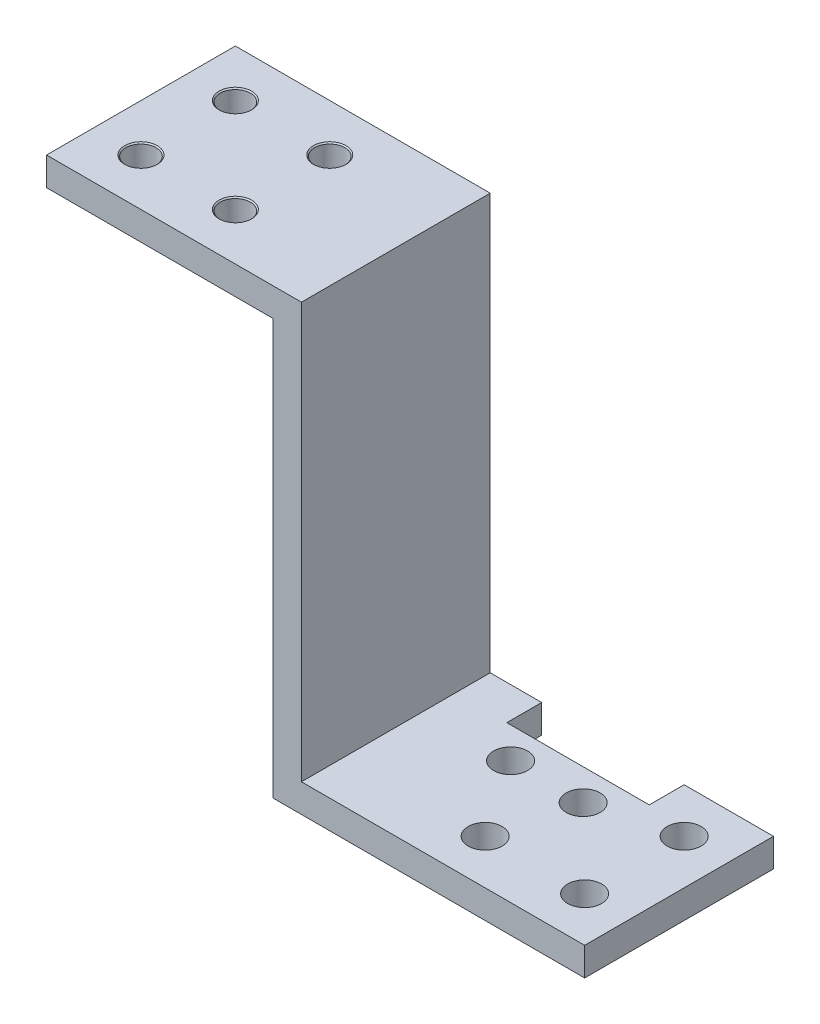
ISO-10303-21;
HEADER;
FILE_DESCRIPTION(('STEP AP214'),'2;1');
FILE_NAME('part.step','',(''),(''),'','','');
FILE_SCHEMA(('AUTOMOTIVE_DESIGN { 1 0 10303 214 1 1 1 1 }'));
ENDSEC;
DATA;
#1=APPLICATION_CONTEXT('core data for automotive mechanical design processes');
#2=APPLICATION_PROTOCOL_DEFINITION('international standard','automotive_design',2000,#1);
#3=PRODUCT_CONTEXT('',#1,'mechanical');
#4=PRODUCT('Part','Part','',(#3));
#5=PRODUCT_RELATED_PRODUCT_CATEGORY('part','',(#4));
#6=PRODUCT_DEFINITION_FORMATION('','',#4);
#7=PRODUCT_DEFINITION_CONTEXT('part definition',#1,'design');
#8=PRODUCT_DEFINITION('design','',#6,#7);
#9=PRODUCT_DEFINITION_SHAPE('','',#8);
#10=(LENGTH_UNIT() NAMED_UNIT(*) SI_UNIT(.MILLI.,.METRE.));
#11=(NAMED_UNIT(*) PLANE_ANGLE_UNIT() SI_UNIT($,.RADIAN.));
#12=(NAMED_UNIT(*) SI_UNIT($,.STERADIAN.) SOLID_ANGLE_UNIT());
#13=UNCERTAINTY_MEASURE_WITH_UNIT(LENGTH_MEASURE(1.E-05),#10,'distance_accuracy_value','');
#14=(GEOMETRIC_REPRESENTATION_CONTEXT(3) GLOBAL_UNCERTAINTY_ASSIGNED_CONTEXT((#13)) GLOBAL_UNIT_ASSIGNED_CONTEXT((#10,
#11,#12)) REPRESENTATION_CONTEXT('',''));
#15=CARTESIAN_POINT('',(0.,0.,0.));
#16=DIRECTION('',(0.,0.,1.));
#17=DIRECTION('',(1.,0.,0.));
#18=AXIS2_PLACEMENT_3D('',#15,#16,#17);
#19=CARTESIAN_POINT('',(0.,0.,0.));
#20=DIRECTION('',(0.,0.,1.));
#21=DIRECTION('',(1.,0.,0.));
#22=AXIS2_PLACEMENT_3D('',#19,#20,#21);
#23=PLANE('',#22);
#24=DIRECTION('',(-1.,0.,0.));
#25=VECTOR('',#24,1.);
#26=CARTESIAN_POINT('',(57.,3.,0.));
#27=LINE('',#26,#25);
#28=CARTESIAN_POINT('',(32.4508015476453,3.,0.));
#29=VERTEX_POINT('',#28);
#30=CARTESIAN_POINT('',(27.,3.,0.));
#31=VERTEX_POINT('',#30);
#32=EDGE_CURVE('E142',#29,#31,#27,.T.);
#33=ORIENTED_EDGE('',*,*,#32,.F.);
#34=DIRECTION('',(0.,1.,0.));
#35=VECTOR('',#34,1.);
#36=CARTESIAN_POINT('',(32.4508015476453,0.,0.));
#37=LINE('',#36,#35);
#38=CARTESIAN_POINT('',(32.4508015476453,0.,0.));
#39=VERTEX_POINT('',#38);
#40=EDGE_CURVE('E238',#39,#29,#37,.T.);
#41=ORIENTED_EDGE('',*,*,#40,.F.);
#42=DIRECTION('',(1.,0.,0.));
#43=VECTOR('',#42,1.);
#44=CARTESIAN_POINT('',(24.,0.,0.));
#45=LINE('',#44,#43);
#46=CARTESIAN_POINT('',(24.,0.,0.));
#47=VERTEX_POINT('',#46);
#48=EDGE_CURVE('E163',#47,#39,#45,.T.);
#49=ORIENTED_EDGE('',*,*,#48,.F.);
#50=DIRECTION('',(0.,-1.,0.));
#51=VECTOR('',#50,1.);
#52=CARTESIAN_POINT('',(24.,44.,0.));
#53=LINE('',#52,#51);
#54=CARTESIAN_POINT('',(24.,44.,0.));
#55=VERTEX_POINT('',#54);
#56=EDGE_CURVE('E160',#55,#47,#53,.T.);
#57=ORIENTED_EDGE('',*,*,#56,.F.);
#58=DIRECTION('',(1.,0.,0.));
#59=VECTOR('',#58,1.);
#60=CARTESIAN_POINT('',(0.,44.,0.));
#61=LINE('',#60,#59);
#62=CARTESIAN_POINT('',(0.,44.,0.));
#63=VERTEX_POINT('',#62);
#64=EDGE_CURVE('E157',#63,#55,#61,.T.);
#65=ORIENTED_EDGE('',*,*,#64,.F.);
#66=DIRECTION('',(0.,-1.,0.));
#67=VECTOR('',#66,1.);
#68=CARTESIAN_POINT('',(0.,47.,0.));
#69=LINE('',#68,#67);
#70=CARTESIAN_POINT('',(0.,47.,0.));
#71=VERTEX_POINT('',#70);
#72=EDGE_CURVE('E154',#71,#63,#69,.T.);
#73=ORIENTED_EDGE('',*,*,#72,.F.);
#74=DIRECTION('',(-1.,0.,0.));
#75=VECTOR('',#74,1.);
#76=CARTESIAN_POINT('',(27.,47.,0.));
#77=LINE('',#76,#75);
#78=CARTESIAN_POINT('',(27.,47.,0.));
#79=VERTEX_POINT('',#78);
#80=EDGE_CURVE('E100',#79,#71,#77,.T.);
#81=ORIENTED_EDGE('',*,*,#80,.F.);
#82=DIRECTION('',(0.,1.,0.));
#83=VECTOR('',#82,1.);
#84=CARTESIAN_POINT('',(27.,3.,0.));
#85=LINE('',#84,#83);
#86=EDGE_CURVE('E171',#31,#79,#85,.T.);
#87=ORIENTED_EDGE('',*,*,#86,.F.);
#88=EDGE_LOOP('',(#33,#41,#49,#57,#65,#73,#81,#87));
#89=FACE_BOUND('',#88,.T.);
#90=ADVANCED_FACE('F41',(#89),#23,.F.);
#91=CARTESIAN_POINT('',(0.,47.,20.));
#92=DIRECTION('',(1.,0.,0.));
#93=DIRECTION('',(0.,0.,-1.));
#94=AXIS2_PLACEMENT_3D('',#91,#92,#93);
#95=PLANE('',#94);
#96=ORIENTED_EDGE('',*,*,#72,.T.);
#97=DIRECTION('',(0.,0.,-1.));
#98=VECTOR('',#97,1.);
#99=CARTESIAN_POINT('',(0.,44.,20.));
#100=LINE('',#99,#98);
#101=CARTESIAN_POINT('',(0.,44.,20.));
#102=VERTEX_POINT('',#101);
#103=EDGE_CURVE('E11',#102,#63,#100,.T.);
#104=ORIENTED_EDGE('',*,*,#103,.F.);
#105=DIRECTION('',(0.,-1.,0.));
#106=VECTOR('',#105,1.);
#107=CARTESIAN_POINT('',(0.,47.,20.));
#108=LINE('',#107,#106);
#109=CARTESIAN_POINT('',(0.,47.,20.));
#110=VERTEX_POINT('',#109);
#111=EDGE_CURVE('E174',#110,#102,#108,.T.);
#112=ORIENTED_EDGE('',*,*,#111,.F.);
#113=DIRECTION('',(0.,0.,-1.));
#114=VECTOR('',#113,1.);
#115=CARTESIAN_POINT('',(0.,47.,20.));
#116=LINE('',#115,#114);
#117=EDGE_CURVE('E150',#110,#71,#116,.T.);
#118=ORIENTED_EDGE('',*,*,#117,.T.);
#119=EDGE_LOOP('',(#96,#104,#112,#118));
#120=FACE_BOUND('',#119,.T.);
#121=ADVANCED_FACE('F43',(#120),#95,.F.);
#122=CARTESIAN_POINT('',(0.,44.,20.));
#123=DIRECTION('',(0.,1.,0.));
#124=DIRECTION('',(0.,0.,1.));
#125=AXIS2_PLACEMENT_3D('',#122,#123,#124);
#126=PLANE('',#125);
#127=CARTESIAN_POINT('',(4.99999999999999,44.,5.));
#128=DIRECTION('',(0.,1.,0.));
#129=DIRECTION('',(0.,0.,1.));
#130=AXIS2_PLACEMENT_3D('',#127,#128,#129);
#131=CIRCLE('',#130,1.59999999999999);
#132=CARTESIAN_POINT('',(4.99999999999999,44.,6.59999999999999));
#133=VERTEX_POINT('',#132);
#134=EDGE_CURVE('E45',#133,#133,#131,.T.);
#135=ORIENTED_EDGE('',*,*,#134,.T.);
#136=EDGE_LOOP('',(#135));
#137=FACE_BOUND('',#136,.T.);
#138=CARTESIAN_POINT('',(4.99999999999999,44.,15.));
#139=DIRECTION('',(0.,1.,0.));
#140=DIRECTION('',(0.,0.,1.));
#141=AXIS2_PLACEMENT_3D('',#138,#139,#140);
#142=CIRCLE('',#141,1.59999999999999);
#143=CARTESIAN_POINT('',(4.99999999999999,44.,16.6));
#144=VERTEX_POINT('',#143);
#145=EDGE_CURVE('E193',#144,#144,#142,.T.);
#146=ORIENTED_EDGE('',*,*,#145,.T.);
#147=EDGE_LOOP('',(#146));
#148=FACE_BOUND('',#147,.T.);
#149=CARTESIAN_POINT('',(15.,44.,5.));
#150=DIRECTION('',(0.,1.,0.));
#151=DIRECTION('',(0.,0.,1.));
#152=AXIS2_PLACEMENT_3D('',#149,#150,#151);
#153=CIRCLE('',#152,1.59999999999999);
#154=CARTESIAN_POINT('',(15.,44.,6.59999999999999));
#155=VERTEX_POINT('',#154);
#156=EDGE_CURVE('E189',#155,#155,#153,.T.);
#157=ORIENTED_EDGE('',*,*,#156,.T.);
#158=EDGE_LOOP('',(#157));
#159=FACE_BOUND('',#158,.T.);
#160=CARTESIAN_POINT('',(15.,44.,15.));
#161=DIRECTION('',(0.,1.,0.));
#162=DIRECTION('',(0.,0.,1.));
#163=AXIS2_PLACEMENT_3D('',#160,#161,#162);
#164=CIRCLE('',#163,1.59999999999999);
#165=CARTESIAN_POINT('',(15.,44.,16.6));
#166=VERTEX_POINT('',#165);
#167=EDGE_CURVE('E158',#166,#166,#164,.T.);
#168=ORIENTED_EDGE('',*,*,#167,.T.);
#169=EDGE_LOOP('',(#168));
#170=FACE_BOUND('',#169,.T.);
#171=ORIENTED_EDGE('',*,*,#64,.T.);
#172=DIRECTION('',(0.,0.,-1.));
#173=VECTOR('',#172,1.);
#174=CARTESIAN_POINT('',(24.,44.,20.));
#175=LINE('',#174,#173);
#176=CARTESIAN_POINT('',(24.,44.,20.));
#177=VERTEX_POINT('',#176);
#178=EDGE_CURVE('E50',#177,#55,#175,.T.);
#179=ORIENTED_EDGE('',*,*,#178,.F.);
#180=DIRECTION('',(1.,0.,0.));
#181=VECTOR('',#180,1.);
#182=CARTESIAN_POINT('',(0.,44.,20.));
#183=LINE('',#182,#181);
#184=EDGE_CURVE('E108',#102,#177,#183,.T.);
#185=ORIENTED_EDGE('',*,*,#184,.F.);
#186=ORIENTED_EDGE('',*,*,#103,.T.);
#187=EDGE_LOOP('',(#171,#179,#185,#186));
#188=FACE_BOUND('',#187,.T.);
#189=ADVANCED_FACE('F259',(#137,#148,#159,#170,#188),#126,.F.);
#190=CARTESIAN_POINT('',(24.,44.,20.));
#191=DIRECTION('',(1.,0.,0.));
#192=DIRECTION('',(0.,1.,0.));
#193=AXIS2_PLACEMENT_3D('',#190,#191,#192);
#194=PLANE('',#193);
#195=ORIENTED_EDGE('',*,*,#56,.T.);
#196=DIRECTION('',(0.,0.,-1.));
#197=VECTOR('',#196,1.);
#198=CARTESIAN_POINT('',(24.,0.,20.));
#199=LINE('',#198,#197);
#200=CARTESIAN_POINT('',(24.,0.,20.));
#201=VERTEX_POINT('',#200);
#202=EDGE_CURVE('E181',#201,#47,#199,.T.);
#203=ORIENTED_EDGE('',*,*,#202,.F.);
#204=DIRECTION('',(0.,-1.,0.));
#205=VECTOR('',#204,1.);
#206=CARTESIAN_POINT('',(24.,44.,20.));
#207=LINE('',#206,#205);
#208=EDGE_CURVE('E218',#177,#201,#207,.T.);
#209=ORIENTED_EDGE('',*,*,#208,.F.);
#210=ORIENTED_EDGE('',*,*,#178,.T.);
#211=EDGE_LOOP('',(#195,#203,#209,#210));
#212=FACE_BOUND('',#211,.T.);
#213=ADVANCED_FACE('F477',(#212),#194,.F.);
#214=CARTESIAN_POINT('',(24.,0.,20.));
#215=DIRECTION('',(0.,1.,0.));
#216=DIRECTION('',(0.,0.,1.));
#217=AXIS2_PLACEMENT_3D('',#214,#215,#216);
#218=PLANE('',#217);
#219=CARTESIAN_POINT('',(41.7300999606955,0.,15.2699000393045));
#220=DIRECTION('',(0.,1.,0.));
#221=DIRECTION('',(0.,0.,1.));
#222=AXIS2_PLACEMENT_3D('',#219,#220,#221);
#223=CIRCLE('',#222,1.8);
#224=CARTESIAN_POINT('',(41.7300999606955,0.,17.0699000393045));
#225=VERTEX_POINT('',#224);
#226=EDGE_CURVE('E416',#225,#225,#223,.T.);
#227=ORIENTED_EDGE('',*,*,#226,.T.);
#228=EDGE_LOOP('',(#227));
#229=FACE_BOUND('',#228,.T.);
#230=CARTESIAN_POINT('',(52.2699000393045,0.,15.2699000393045));
#231=DIRECTION('',(0.,1.,0.));
#232=DIRECTION('',(0.,0.,1.));
#233=AXIS2_PLACEMENT_3D('',#230,#231,#232);
#234=CIRCLE('',#233,1.8);
#235=CARTESIAN_POINT('',(52.2699000393045,0.,17.0699000393045));
#236=VERTEX_POINT('',#235);
#237=EDGE_CURVE('E427',#236,#236,#234,.T.);
#238=ORIENTED_EDGE('',*,*,#237,.T.);
#239=EDGE_LOOP('',(#238));
#240=FACE_BOUND('',#239,.T.);
#241=CARTESIAN_POINT('',(52.2699000393045,0.,4.73009996069547));
#242=DIRECTION('',(0.,1.,0.));
#243=DIRECTION('',(0.,0.,1.));
#244=AXIS2_PLACEMENT_3D('',#241,#242,#243);
#245=CIRCLE('',#244,1.8);
#246=CARTESIAN_POINT('',(52.2699000393045,0.,6.53009996069546));
#247=VERTEX_POINT('',#246);
#248=EDGE_CURVE('E433',#247,#247,#245,.T.);
#249=ORIENTED_EDGE('',*,*,#248,.T.);
#250=EDGE_LOOP('',(#249));
#251=FACE_BOUND('',#250,.T.);
#252=CARTESIAN_POINT('',(36.1508015476453,0.,6.99558979075441));
#253=DIRECTION('',(0.,1.,0.));
#254=DIRECTION('',(0.,0.,1.));
#255=AXIS2_PLACEMENT_3D('',#252,#253,#254);
#256=CIRCLE('',#255,1.8);
#257=CARTESIAN_POINT('',(36.1508015476453,0.,8.79558979075441));
#258=VERTEX_POINT('',#257);
#259=EDGE_CURVE('E439',#258,#258,#256,.T.);
#260=ORIENTED_EDGE('',*,*,#259,.T.);
#261=EDGE_LOOP('',(#260));
#262=FACE_BOUND('',#261,.T.);
#263=CARTESIAN_POINT('',(43.8398000786091,0.,6.99558979075443));
#264=DIRECTION('',(0.,1.,0.));
#265=DIRECTION('',(0.,0.,1.));
#266=AXIS2_PLACEMENT_3D('',#263,#264,#265);
#267=CIRCLE('',#266,1.8);
#268=CARTESIAN_POINT('',(43.8398000786091,0.,8.79558979075443));
#269=VERTEX_POINT('',#268);
#270=EDGE_CURVE('E445',#269,#269,#267,.T.);
#271=ORIENTED_EDGE('',*,*,#270,.T.);
#272=EDGE_LOOP('',(#271));
#273=FACE_BOUND('',#272,.T.);
#274=ORIENTED_EDGE('',*,*,#48,.T.);
#275=DIRECTION('',(0.,0.,1.));
#276=VECTOR('',#275,1.);
#277=CARTESIAN_POINT('',(32.4508015476453,0.,0.));
#278=LINE('',#277,#276);
#279=CARTESIAN_POINT('',(32.4508015476453,0.,3.69558979075439));
#280=VERTEX_POINT('',#279);
#281=EDGE_CURVE('E449',#39,#280,#278,.T.);
#282=ORIENTED_EDGE('',*,*,#281,.T.);
#283=DIRECTION('',(1.,0.,0.));
#284=VECTOR('',#283,1.);
#285=CARTESIAN_POINT('',(32.4508015476453,0.,3.69558979075439));
#286=LINE('',#285,#284);
#287=CARTESIAN_POINT('',(47.5398000786091,0.,3.69558979075439));
#288=VERTEX_POINT('',#287);
#289=EDGE_CURVE('E452',#280,#288,#286,.T.);
#290=ORIENTED_EDGE('',*,*,#289,.T.);
#291=DIRECTION('',(0.,0.,-1.));
#292=VECTOR('',#291,1.);
#293=CARTESIAN_POINT('',(47.5398000786091,0.,0.));
#294=LINE('',#293,#292);
#295=CARTESIAN_POINT('',(47.5398000786091,0.,0.));
#296=VERTEX_POINT('',#295);
#297=EDGE_CURVE('E250',#288,#296,#294,.T.);
#298=ORIENTED_EDGE('',*,*,#297,.T.);
#299=CARTESIAN_POINT('',(57.,0.,0.));
#300=VERTEX_POINT('',#299);
#301=EDGE_CURVE('E162',#296,#300,#45,.T.);
#302=ORIENTED_EDGE('',*,*,#301,.T.);
#303=DIRECTION('',(0.,0.,-1.));
#304=VECTOR('',#303,1.);
#305=CARTESIAN_POINT('',(57.,0.,20.));
#306=LINE('',#305,#304);
#307=CARTESIAN_POINT('',(57.,0.,20.));
#308=VERTEX_POINT('',#307);
#309=EDGE_CURVE('E178',#308,#300,#306,.T.);
#310=ORIENTED_EDGE('',*,*,#309,.F.);
#311=DIRECTION('',(1.,0.,0.));
#312=VECTOR('',#311,1.);
#313=CARTESIAN_POINT('',(24.,0.,20.));
#314=LINE('',#313,#312);
#315=EDGE_CURVE('E220',#201,#308,#314,.T.);
#316=ORIENTED_EDGE('',*,*,#315,.F.);
#317=ORIENTED_EDGE('',*,*,#202,.T.);
#318=EDGE_LOOP('',(#274,#282,#290,#298,#302,#310,#316,#317));
#319=FACE_BOUND('',#318,.T.);
#320=ADVANCED_FACE('F226',(#229,#240,#251,#262,#273,#319),#218,.F.);
#321=CARTESIAN_POINT('',(57.,0.,20.));
#322=DIRECTION('',(-1.,0.,0.));
#323=DIRECTION('',(0.,-1.,0.));
#324=AXIS2_PLACEMENT_3D('',#321,#322,#323);
#325=PLANE('',#324);
#326=DIRECTION('',(0.,1.,0.));
#327=VECTOR('',#326,1.);
#328=CARTESIAN_POINT('',(57.,0.,0.));
#329=LINE('',#328,#327);
#330=CARTESIAN_POINT('',(57.,3.,0.));
#331=VERTEX_POINT('',#330);
#332=EDGE_CURVE('E166',#300,#331,#329,.T.);
#333=ORIENTED_EDGE('',*,*,#332,.T.);
#334=DIRECTION('',(0.,0.,-1.));
#335=VECTOR('',#334,1.);
#336=CARTESIAN_POINT('',(57.,3.,20.));
#337=LINE('',#336,#335);
#338=CARTESIAN_POINT('',(57.,3.,20.));
#339=VERTEX_POINT('',#338);
#340=EDGE_CURVE('E145',#339,#331,#337,.T.);
#341=ORIENTED_EDGE('',*,*,#340,.F.);
#342=DIRECTION('',(0.,1.,0.));
#343=VECTOR('',#342,1.);
#344=CARTESIAN_POINT('',(57.,0.,20.));
#345=LINE('',#344,#343);
#346=EDGE_CURVE('E131',#308,#339,#345,.T.);
#347=ORIENTED_EDGE('',*,*,#346,.F.);
#348=ORIENTED_EDGE('',*,*,#309,.T.);
#349=EDGE_LOOP('',(#333,#341,#347,#348));
#350=FACE_BOUND('',#349,.T.);
#351=ADVANCED_FACE('F231',(#350),#325,.F.);
#352=CARTESIAN_POINT('',(57.,3.,20.));
#353=DIRECTION('',(0.,-1.,0.));
#354=DIRECTION('',(1.,0.,0.));
#355=AXIS2_PLACEMENT_3D('',#352,#353,#354);
#356=PLANE('',#355);
#357=CARTESIAN_POINT('',(41.7300999606955,3.,15.2699000393045));
#358=DIRECTION('',(0.,1.,0.));
#359=DIRECTION('',(0.,0.,1.));
#360=AXIS2_PLACEMENT_3D('',#357,#358,#359);
#361=CIRCLE('',#360,1.79999999999999);
#362=CARTESIAN_POINT('',(41.7300999606955,3.,17.0699000393045));
#363=VERTEX_POINT('',#362);
#364=EDGE_CURVE('E419',#363,#363,#361,.T.);
#365=ORIENTED_EDGE('',*,*,#364,.F.);
#366=EDGE_LOOP('',(#365));
#367=FACE_BOUND('',#366,.T.);
#368=CARTESIAN_POINT('',(52.2699000393045,3.,15.2699000393045));
#369=DIRECTION('',(0.,1.,0.));
#370=DIRECTION('',(0.,0.,1.));
#371=AXIS2_PLACEMENT_3D('',#368,#369,#370);
#372=CIRCLE('',#371,1.79999999999999);
#373=CARTESIAN_POINT('',(52.2699000393045,3.,17.0699000393045));
#374=VERTEX_POINT('',#373);
#375=EDGE_CURVE('E422',#374,#374,#372,.T.);
#376=ORIENTED_EDGE('',*,*,#375,.F.);
#377=EDGE_LOOP('',(#376));
#378=FACE_BOUND('',#377,.T.);
#379=CARTESIAN_POINT('',(52.2699000393045,3.,4.73009996069547));
#380=DIRECTION('',(0.,1.,0.));
#381=DIRECTION('',(0.,0.,1.));
#382=AXIS2_PLACEMENT_3D('',#379,#380,#381);
#383=CIRCLE('',#382,1.79999999999999);
#384=CARTESIAN_POINT('',(52.2699000393045,3.,6.53009996069546));
#385=VERTEX_POINT('',#384);
#386=EDGE_CURVE('E430',#385,#385,#383,.T.);
#387=ORIENTED_EDGE('',*,*,#386,.F.);
#388=EDGE_LOOP('',(#387));
#389=FACE_BOUND('',#388,.T.);
#390=CARTESIAN_POINT('',(36.1508015476453,3.,6.99558979075441));
#391=DIRECTION('',(0.,1.,0.));
#392=DIRECTION('',(0.,0.,1.));
#393=AXIS2_PLACEMENT_3D('',#390,#391,#392);
#394=CIRCLE('',#393,1.8);
#395=CARTESIAN_POINT('',(36.1508015476453,3.,8.79558979075441));
#396=VERTEX_POINT('',#395);
#397=EDGE_CURVE('E436',#396,#396,#394,.T.);
#398=ORIENTED_EDGE('',*,*,#397,.F.);
#399=EDGE_LOOP('',(#398));
#400=FACE_BOUND('',#399,.T.);
#401=CARTESIAN_POINT('',(43.8398000786091,3.,6.99558979075443));
#402=DIRECTION('',(0.,1.,0.));
#403=DIRECTION('',(0.,0.,1.));
#404=AXIS2_PLACEMENT_3D('',#401,#402,#403);
#405=CIRCLE('',#404,1.8);
#406=CARTESIAN_POINT('',(43.8398000786091,3.,8.79558979075443));
#407=VERTEX_POINT('',#406);
#408=EDGE_CURVE('E442',#407,#407,#405,.T.);
#409=ORIENTED_EDGE('',*,*,#408,.F.);
#410=EDGE_LOOP('',(#409));
#411=FACE_BOUND('',#410,.T.);
#412=DIRECTION('',(1.,0.,0.));
#413=VECTOR('',#412,1.);
#414=CARTESIAN_POINT('',(32.4508015476453,3.,3.69558979075439));
#415=LINE('',#414,#413);
#416=CARTESIAN_POINT('',(32.4508015476453,3.,3.69558979075439));
#417=VERTEX_POINT('',#416);
#418=CARTESIAN_POINT('',(47.5398000786091,3.,3.69558979075439));
#419=VERTEX_POINT('',#418);
#420=EDGE_CURVE('E458',#417,#419,#415,.T.);
#421=ORIENTED_EDGE('',*,*,#420,.F.);
#422=DIRECTION('',(0.,0.,1.));
#423=VECTOR('',#422,1.);
#424=CARTESIAN_POINT('',(32.4508015476453,3.,0.));
#425=LINE('',#424,#423);
#426=EDGE_CURVE('E448',#29,#417,#425,.T.);
#427=ORIENTED_EDGE('',*,*,#426,.F.);
#428=ORIENTED_EDGE('',*,*,#32,.T.);
#429=DIRECTION('',(0.,0.,-1.));
#430=VECTOR('',#429,1.);
#431=CARTESIAN_POINT('',(27.,3.,20.));
#432=LINE('',#431,#430);
#433=CARTESIAN_POINT('',(27.,3.,20.));
#434=VERTEX_POINT('',#433);
#435=EDGE_CURVE('E137',#434,#31,#432,.T.);
#436=ORIENTED_EDGE('',*,*,#435,.F.);
#437=DIRECTION('',(-1.,0.,0.));
#438=VECTOR('',#437,1.);
#439=CARTESIAN_POINT('',(57.,3.,20.));
#440=LINE('',#439,#438);
#441=EDGE_CURVE('E124',#339,#434,#440,.T.);
#442=ORIENTED_EDGE('',*,*,#441,.F.);
#443=ORIENTED_EDGE('',*,*,#340,.T.);
#444=CARTESIAN_POINT('',(47.5398000786091,3.,0.));
#445=VERTEX_POINT('',#444);
#446=EDGE_CURVE('E168',#331,#445,#27,.T.);
#447=ORIENTED_EDGE('',*,*,#446,.T.);
#448=DIRECTION('',(0.,0.,-1.));
#449=VECTOR('',#448,1.);
#450=CARTESIAN_POINT('',(47.5398000786091,3.,0.));
#451=LINE('',#450,#449);
#452=EDGE_CURVE('E58',#419,#445,#451,.T.);
#453=ORIENTED_EDGE('',*,*,#452,.F.);
#454=EDGE_LOOP('',(#421,#427,#428,#436,#442,#443,#447,#453));
#455=FACE_BOUND('',#454,.T.);
#456=ADVANCED_FACE('F139',(#367,#378,#389,#400,#411,#455),#356,.F.);
#457=CARTESIAN_POINT('',(27.,3.,20.));
#458=DIRECTION('',(-1.,0.,0.));
#459=DIRECTION('',(0.,-1.,0.));
#460=AXIS2_PLACEMENT_3D('',#457,#458,#459);
#461=PLANE('',#460);
#462=ORIENTED_EDGE('',*,*,#86,.T.);
#463=DIRECTION('',(0.,0.,-1.));
#464=VECTOR('',#463,1.);
#465=CARTESIAN_POINT('',(27.,47.,20.));
#466=LINE('',#465,#464);
#467=CARTESIAN_POINT('',(27.,47.,20.));
#468=VERTEX_POINT('',#467);
#469=EDGE_CURVE('E146',#468,#79,#466,.T.);
#470=ORIENTED_EDGE('',*,*,#469,.F.);
#471=DIRECTION('',(0.,1.,0.));
#472=VECTOR('',#471,1.);
#473=CARTESIAN_POINT('',(27.,3.,20.));
#474=LINE('',#473,#472);
#475=EDGE_CURVE('E128',#434,#468,#474,.T.);
#476=ORIENTED_EDGE('',*,*,#475,.F.);
#477=ORIENTED_EDGE('',*,*,#435,.T.);
#478=EDGE_LOOP('',(#462,#470,#476,#477));
#479=FACE_BOUND('',#478,.T.);
#480=ADVANCED_FACE('F148',(#479),#461,.F.);
#481=CARTESIAN_POINT('',(27.,47.,20.));
#482=DIRECTION('',(0.,-1.,0.));
#483=DIRECTION('',(1.,0.,0.));
#484=AXIS2_PLACEMENT_3D('',#481,#482,#483);
#485=PLANE('',#484);
#486=CARTESIAN_POINT('',(4.99999999999999,47.,5.));
#487=DIRECTION('',(0.,1.,0.));
#488=DIRECTION('',(0.,0.,1.));
#489=AXIS2_PLACEMENT_3D('',#486,#487,#488);
#490=CIRCLE('',#489,1.725);
#491=CARTESIAN_POINT('',(4.99999999999999,47.,6.725));
#492=VERTEX_POINT('',#491);
#493=EDGE_CURVE('E242',#492,#492,#490,.T.);
#494=ORIENTED_EDGE('',*,*,#493,.F.);
#495=EDGE_LOOP('',(#494));
#496=FACE_BOUND('',#495,.T.);
#497=CARTESIAN_POINT('',(4.99999999999999,47.,15.));
#498=DIRECTION('',(0.,1.,0.));
#499=DIRECTION('',(0.,0.,1.));
#500=AXIS2_PLACEMENT_3D('',#497,#498,#499);
#501=CIRCLE('',#500,1.725);
#502=CARTESIAN_POINT('',(4.99999999999999,47.,16.725));
#503=VERTEX_POINT('',#502);
#504=EDGE_CURVE('E202',#503,#503,#501,.T.);
#505=ORIENTED_EDGE('',*,*,#504,.F.);
#506=EDGE_LOOP('',(#505));
#507=FACE_BOUND('',#506,.T.);
#508=CARTESIAN_POINT('',(15.,47.,5.));
#509=DIRECTION('',(0.,1.,0.));
#510=DIRECTION('',(0.,0.,1.));
#511=AXIS2_PLACEMENT_3D('',#508,#509,#510);
#512=CIRCLE('',#511,1.725);
#513=CARTESIAN_POINT('',(15.,47.,6.725));
#514=VERTEX_POINT('',#513);
#515=EDGE_CURVE('E195',#514,#514,#512,.T.);
#516=ORIENTED_EDGE('',*,*,#515,.F.);
#517=EDGE_LOOP('',(#516));
#518=FACE_BOUND('',#517,.T.);
#519=CARTESIAN_POINT('',(15.,47.,15.));
#520=DIRECTION('',(0.,1.,0.));
#521=DIRECTION('',(0.,0.,1.));
#522=AXIS2_PLACEMENT_3D('',#519,#520,#521);
#523=CIRCLE('',#522,1.725);
#524=CARTESIAN_POINT('',(15.,47.,16.725));
#525=VERTEX_POINT('',#524);
#526=EDGE_CURVE('E191',#525,#525,#523,.T.);
#527=ORIENTED_EDGE('',*,*,#526,.F.);
#528=EDGE_LOOP('',(#527));
#529=FACE_BOUND('',#528,.T.);
#530=ORIENTED_EDGE('',*,*,#80,.T.);
#531=ORIENTED_EDGE('',*,*,#117,.F.);
#532=DIRECTION('',(-1.,0.,0.));
#533=VECTOR('',#532,1.);
#534=CARTESIAN_POINT('',(27.,47.,20.));
#535=LINE('',#534,#533);
#536=EDGE_CURVE('E67',#468,#110,#535,.T.);
#537=ORIENTED_EDGE('',*,*,#536,.F.);
#538=ORIENTED_EDGE('',*,*,#469,.T.);
#539=EDGE_LOOP('',(#530,#531,#537,#538));
#540=FACE_BOUND('',#539,.T.);
#541=ADVANCED_FACE('F295',(#496,#507,#518,#529,#540),#485,.F.);
#542=CARTESIAN_POINT('',(0.,0.,20.));
#543=DIRECTION('',(0.,0.,1.));
#544=DIRECTION('',(1.,0.,0.));
#545=AXIS2_PLACEMENT_3D('',#542,#543,#544);
#546=PLANE('',#545);
#547=ORIENTED_EDGE('',*,*,#111,.T.);
#548=ORIENTED_EDGE('',*,*,#184,.T.);
#549=ORIENTED_EDGE('',*,*,#208,.T.);
#550=ORIENTED_EDGE('',*,*,#315,.T.);
#551=ORIENTED_EDGE('',*,*,#346,.T.);
#552=ORIENTED_EDGE('',*,*,#441,.T.);
#553=ORIENTED_EDGE('',*,*,#475,.T.);
#554=ORIENTED_EDGE('',*,*,#536,.T.);
#555=EDGE_LOOP('',(#547,#548,#549,#550,#551,#552,#553,#554));
#556=FACE_BOUND('',#555,.T.);
#557=ADVANCED_FACE('F126',(#556),#546,.T.);
#558=ORIENTED_EDGE('',*,*,#301,.F.);
#559=DIRECTION('',(0.,1.,0.));
#560=VECTOR('',#559,1.);
#561=CARTESIAN_POINT('',(47.5398000786091,0.,0.));
#562=LINE('',#561,#560);
#563=EDGE_CURVE('E235',#296,#445,#562,.T.);
#564=ORIENTED_EDGE('',*,*,#563,.T.);
#565=ORIENTED_EDGE('',*,*,#446,.F.);
#566=ORIENTED_EDGE('',*,*,#332,.F.);
#567=EDGE_LOOP('',(#558,#564,#565,#566));
#568=FACE_BOUND('',#567,.T.);
#569=ADVANCED_FACE('F234',(#568),#23,.F.);
#570=CARTESIAN_POINT('',(15.,47.,15.));
#571=DIRECTION('',(0.,1.,0.));
#572=DIRECTION('',(0.,0.,1.));
#573=AXIS2_PLACEMENT_3D('',#570,#571,#572);
#574=CYLINDRICAL_SURFACE('',#573,1.59999999999999);
#575=CARTESIAN_POINT('',(15.,46.875,15.));
#576=DIRECTION('',(0.,1.,0.));
#577=DIRECTION('',(0.,0.,1.));
#578=AXIS2_PLACEMENT_3D('',#575,#576,#577);
#579=CIRCLE('',#578,1.59999999999999);
#580=CARTESIAN_POINT('',(15.,46.875,16.6));
#581=VERTEX_POINT('',#580);
#582=EDGE_CURVE('E188',#581,#581,#579,.T.);
#583=ORIENTED_EDGE('',*,*,#582,.T.);
#584=EDGE_LOOP('',(#583));
#585=FACE_BOUND('',#584,.T.);
#586=ORIENTED_EDGE('',*,*,#167,.F.);
#587=EDGE_LOOP('',(#586));
#588=FACE_BOUND('',#587,.T.);
#589=ADVANCED_FACE('F286',(#585,#588),#574,.F.);
#590=CARTESIAN_POINT('',(15.,47.,15.));
#591=DIRECTION('',(0.,1.,0.));
#592=DIRECTION('',(0.,0.,1.));
#593=AXIS2_PLACEMENT_3D('',#590,#591,#592);
#594=CONICAL_SURFACE('',#593,1.725,0.785398163397448);
#595=ORIENTED_EDGE('',*,*,#582,.F.);
#596=EDGE_LOOP('',(#595));
#597=FACE_BOUND('',#596,.T.);
#598=ORIENTED_EDGE('',*,*,#526,.T.);
#599=EDGE_LOOP('',(#598));
#600=FACE_BOUND('',#599,.T.);
#601=ADVANCED_FACE('F291',(#597,#600),#594,.F.);
#602=CARTESIAN_POINT('',(15.,47.,5.));
#603=DIRECTION('',(0.,1.,0.));
#604=DIRECTION('',(0.,0.,1.));
#605=AXIS2_PLACEMENT_3D('',#602,#603,#604);
#606=CYLINDRICAL_SURFACE('',#605,1.59999999999999);
#607=CARTESIAN_POINT('',(15.,46.875,5.));
#608=DIRECTION('',(0.,1.,0.));
#609=DIRECTION('',(0.,0.,1.));
#610=AXIS2_PLACEMENT_3D('',#607,#608,#609);
#611=CIRCLE('',#610,1.59999999999999);
#612=CARTESIAN_POINT('',(15.,46.875,6.59999999999999));
#613=VERTEX_POINT('',#612);
#614=EDGE_CURVE('E192',#613,#613,#611,.T.);
#615=ORIENTED_EDGE('',*,*,#614,.T.);
#616=EDGE_LOOP('',(#615));
#617=FACE_BOUND('',#616,.T.);
#618=ORIENTED_EDGE('',*,*,#156,.F.);
#619=EDGE_LOOP('',(#618));
#620=FACE_BOUND('',#619,.T.);
#621=ADVANCED_FACE('F305',(#617,#620),#606,.F.);
#622=CARTESIAN_POINT('',(15.,47.,5.));
#623=DIRECTION('',(0.,1.,0.));
#624=DIRECTION('',(0.,0.,1.));
#625=AXIS2_PLACEMENT_3D('',#622,#623,#624);
#626=CONICAL_SURFACE('',#625,1.725,0.785398163397448);
#627=ORIENTED_EDGE('',*,*,#614,.F.);
#628=EDGE_LOOP('',(#627));
#629=FACE_BOUND('',#628,.T.);
#630=ORIENTED_EDGE('',*,*,#515,.T.);
#631=EDGE_LOOP('',(#630));
#632=FACE_BOUND('',#631,.T.);
#633=ADVANCED_FACE('F309',(#629,#632),#626,.F.);
#634=CARTESIAN_POINT('',(4.99999999999999,47.,15.));
#635=DIRECTION('',(0.,1.,0.));
#636=DIRECTION('',(0.,0.,1.));
#637=AXIS2_PLACEMENT_3D('',#634,#635,#636);
#638=CYLINDRICAL_SURFACE('',#637,1.59999999999999);
#639=CARTESIAN_POINT('',(4.99999999999999,46.875,15.));
#640=DIRECTION('',(0.,1.,0.));
#641=DIRECTION('',(0.,0.,1.));
#642=AXIS2_PLACEMENT_3D('',#639,#640,#641);
#643=CIRCLE('',#642,1.59999999999999);
#644=CARTESIAN_POINT('',(4.99999999999999,46.875,16.6));
#645=VERTEX_POINT('',#644);
#646=EDGE_CURVE('E196',#645,#645,#643,.T.);
#647=ORIENTED_EDGE('',*,*,#646,.T.);
#648=EDGE_LOOP('',(#647));
#649=FACE_BOUND('',#648,.T.);
#650=ORIENTED_EDGE('',*,*,#145,.F.);
#651=EDGE_LOOP('',(#650));
#652=FACE_BOUND('',#651,.T.);
#653=ADVANCED_FACE('F273',(#649,#652),#638,.F.);
#654=CARTESIAN_POINT('',(4.99999999999999,47.,15.));
#655=DIRECTION('',(0.,1.,0.));
#656=DIRECTION('',(0.,0.,1.));
#657=AXIS2_PLACEMENT_3D('',#654,#655,#656);
#658=CONICAL_SURFACE('',#657,1.725,0.785398163397448);
#659=ORIENTED_EDGE('',*,*,#646,.F.);
#660=EDGE_LOOP('',(#659));
#661=FACE_BOUND('',#660,.T.);
#662=ORIENTED_EDGE('',*,*,#504,.T.);
#663=EDGE_LOOP('',(#662));
#664=FACE_BOUND('',#663,.T.);
#665=ADVANCED_FACE('F264',(#661,#664),#658,.F.);
#666=CARTESIAN_POINT('',(4.99999999999999,47.,5.));
#667=DIRECTION('',(0.,1.,0.));
#668=DIRECTION('',(0.,0.,1.));
#669=AXIS2_PLACEMENT_3D('',#666,#667,#668);
#670=CYLINDRICAL_SURFACE('',#669,1.59999999999999);
#671=CARTESIAN_POINT('',(4.99999999999999,46.875,5.));
#672=DIRECTION('',(0.,1.,0.));
#673=DIRECTION('',(0.,0.,1.));
#674=AXIS2_PLACEMENT_3D('',#671,#672,#673);
#675=CIRCLE('',#674,1.59999999999999);
#676=CARTESIAN_POINT('',(4.99999999999999,46.875,6.59999999999999));
#677=VERTEX_POINT('',#676);
#678=EDGE_CURVE('E252',#677,#677,#675,.T.);
#679=ORIENTED_EDGE('',*,*,#678,.T.);
#680=EDGE_LOOP('',(#679));
#681=FACE_BOUND('',#680,.T.);
#682=ORIENTED_EDGE('',*,*,#134,.F.);
#683=EDGE_LOOP('',(#682));
#684=FACE_BOUND('',#683,.T.);
#685=ADVANCED_FACE('F261',(#681,#684),#670,.F.);
#686=CARTESIAN_POINT('',(4.99999999999999,47.,5.));
#687=DIRECTION('',(0.,1.,0.));
#688=DIRECTION('',(0.,0.,1.));
#689=AXIS2_PLACEMENT_3D('',#686,#687,#688);
#690=CONICAL_SURFACE('',#689,1.725,0.785398163397448);
#691=ORIENTED_EDGE('',*,*,#678,.F.);
#692=EDGE_LOOP('',(#691));
#693=FACE_BOUND('',#692,.T.);
#694=ORIENTED_EDGE('',*,*,#493,.T.);
#695=EDGE_LOOP('',(#694));
#696=FACE_BOUND('',#695,.T.);
#697=ADVANCED_FACE('F263',(#693,#696),#690,.F.);
#698=CARTESIAN_POINT('',(32.4508015476453,0.,0.));
#699=DIRECTION('',(-1.,0.,0.));
#700=DIRECTION('',(0.,0.,1.));
#701=AXIS2_PLACEMENT_3D('',#698,#699,#700);
#702=PLANE('',#701);
#703=ORIENTED_EDGE('',*,*,#426,.T.);
#704=DIRECTION('',(0.,1.,0.));
#705=VECTOR('',#704,1.);
#706=CARTESIAN_POINT('',(32.4508015476453,0.,3.69558979075439));
#707=LINE('',#706,#705);
#708=EDGE_CURVE('E244',#280,#417,#707,.T.);
#709=ORIENTED_EDGE('',*,*,#708,.F.);
#710=ORIENTED_EDGE('',*,*,#281,.F.);
#711=ORIENTED_EDGE('',*,*,#40,.T.);
#712=EDGE_LOOP('',(#703,#709,#710,#711));
#713=FACE_BOUND('',#712,.T.);
#714=ADVANCED_FACE('F270',(#713),#702,.F.);
#715=CARTESIAN_POINT('',(47.5398000786091,0.,0.));
#716=DIRECTION('',(1.,0.,0.));
#717=DIRECTION('',(0.,0.,-1.));
#718=AXIS2_PLACEMENT_3D('',#715,#716,#717);
#719=PLANE('',#718);
#720=ORIENTED_EDGE('',*,*,#452,.T.);
#721=ORIENTED_EDGE('',*,*,#563,.F.);
#722=ORIENTED_EDGE('',*,*,#297,.F.);
#723=DIRECTION('',(0.,1.,0.));
#724=VECTOR('',#723,1.);
#725=CARTESIAN_POINT('',(47.5398000786091,0.,3.69558979075439));
#726=LINE('',#725,#724);
#727=EDGE_CURVE('E239',#288,#419,#726,.T.);
#728=ORIENTED_EDGE('',*,*,#727,.T.);
#729=EDGE_LOOP('',(#720,#721,#722,#728));
#730=FACE_BOUND('',#729,.T.);
#731=ADVANCED_FACE('F339',(#730),#719,.F.);
#732=CARTESIAN_POINT('',(32.4508015476453,0.,3.69558979075439));
#733=DIRECTION('',(0.,0.,1.));
#734=DIRECTION('',(1.,0.,0.));
#735=AXIS2_PLACEMENT_3D('',#732,#733,#734);
#736=PLANE('',#735);
#737=ORIENTED_EDGE('',*,*,#420,.T.);
#738=ORIENTED_EDGE('',*,*,#727,.F.);
#739=ORIENTED_EDGE('',*,*,#289,.F.);
#740=ORIENTED_EDGE('',*,*,#708,.T.);
#741=EDGE_LOOP('',(#737,#738,#739,#740));
#742=FACE_BOUND('',#741,.T.);
#743=ADVANCED_FACE('F349',(#742),#736,.F.);
#744=CARTESIAN_POINT('',(43.8398000786091,3.,6.99558979075443));
#745=DIRECTION('',(0.,1.,0.));
#746=DIRECTION('',(0.,0.,1.));
#747=AXIS2_PLACEMENT_3D('',#744,#745,#746);
#748=CYLINDRICAL_SURFACE('',#747,1.8);
#749=ORIENTED_EDGE('',*,*,#270,.F.);
#750=EDGE_LOOP('',(#749));
#751=FACE_BOUND('',#750,.T.);
#752=ORIENTED_EDGE('',*,*,#408,.T.);
#753=EDGE_LOOP('',(#752));
#754=FACE_BOUND('',#753,.T.);
#755=ADVANCED_FACE('F358',(#751,#754),#748,.F.);
#756=CARTESIAN_POINT('',(36.1508015476453,3.,6.99558979075441));
#757=DIRECTION('',(0.,1.,0.));
#758=DIRECTION('',(0.,0.,1.));
#759=AXIS2_PLACEMENT_3D('',#756,#757,#758);
#760=CYLINDRICAL_SURFACE('',#759,1.8);
#761=ORIENTED_EDGE('',*,*,#259,.F.);
#762=EDGE_LOOP('',(#761));
#763=FACE_BOUND('',#762,.T.);
#764=ORIENTED_EDGE('',*,*,#397,.T.);
#765=EDGE_LOOP('',(#764));
#766=FACE_BOUND('',#765,.T.);
#767=ADVANCED_FACE('F368',(#763,#766),#760,.F.);
#768=CARTESIAN_POINT('',(52.2699000393045,3.,4.73009996069547));
#769=DIRECTION('',(0.,1.,0.));
#770=DIRECTION('',(0.,0.,1.));
#771=AXIS2_PLACEMENT_3D('',#768,#769,#770);
#772=CYLINDRICAL_SURFACE('',#771,1.79999999999999);
#773=ORIENTED_EDGE('',*,*,#248,.F.);
#774=EDGE_LOOP('',(#773));
#775=FACE_BOUND('',#774,.T.);
#776=ORIENTED_EDGE('',*,*,#386,.T.);
#777=EDGE_LOOP('',(#776));
#778=FACE_BOUND('',#777,.T.);
#779=ADVANCED_FACE('F378',(#775,#778),#772,.F.);
#780=CARTESIAN_POINT('',(52.2699000393045,3.,15.2699000393045));
#781=DIRECTION('',(0.,1.,0.));
#782=DIRECTION('',(0.,0.,1.));
#783=AXIS2_PLACEMENT_3D('',#780,#781,#782);
#784=CYLINDRICAL_SURFACE('',#783,1.79999999999999);
#785=ORIENTED_EDGE('',*,*,#237,.F.);
#786=EDGE_LOOP('',(#785));
#787=FACE_BOUND('',#786,.T.);
#788=ORIENTED_EDGE('',*,*,#375,.T.);
#789=EDGE_LOOP('',(#788));
#790=FACE_BOUND('',#789,.T.);
#791=ADVANCED_FACE('F389',(#787,#790),#784,.F.);
#792=CARTESIAN_POINT('',(41.7300999606955,3.,15.2699000393045));
#793=DIRECTION('',(0.,1.,0.));
#794=DIRECTION('',(0.,0.,1.));
#795=AXIS2_PLACEMENT_3D('',#792,#793,#794);
#796=CYLINDRICAL_SURFACE('',#795,1.79999999999999);
#797=ORIENTED_EDGE('',*,*,#226,.F.);
#798=EDGE_LOOP('',(#797));
#799=FACE_BOUND('',#798,.T.);
#800=ORIENTED_EDGE('',*,*,#364,.T.);
#801=EDGE_LOOP('',(#800));
#802=FACE_BOUND('',#801,.T.);
#803=ADVANCED_FACE('F400',(#799,#802),#796,.F.);
#804=CLOSED_SHELL('',(#90,#121,#189,#213,#320,#351,#456,#480,#541,#557,#569,#589,#601,#621,#633,
#653,#665,#685,#697,#714,#731,#743,#755,#767,#779,#791,#803));
#805=MANIFOLD_SOLID_BREP('B2',#804);
#806=ADVANCED_BREP_SHAPE_REPRESENTATION('',(#18,#805),#14);
#807=SHAPE_DEFINITION_REPRESENTATION(#9,#806);
ENDSEC;
END-ISO-10303-21;
